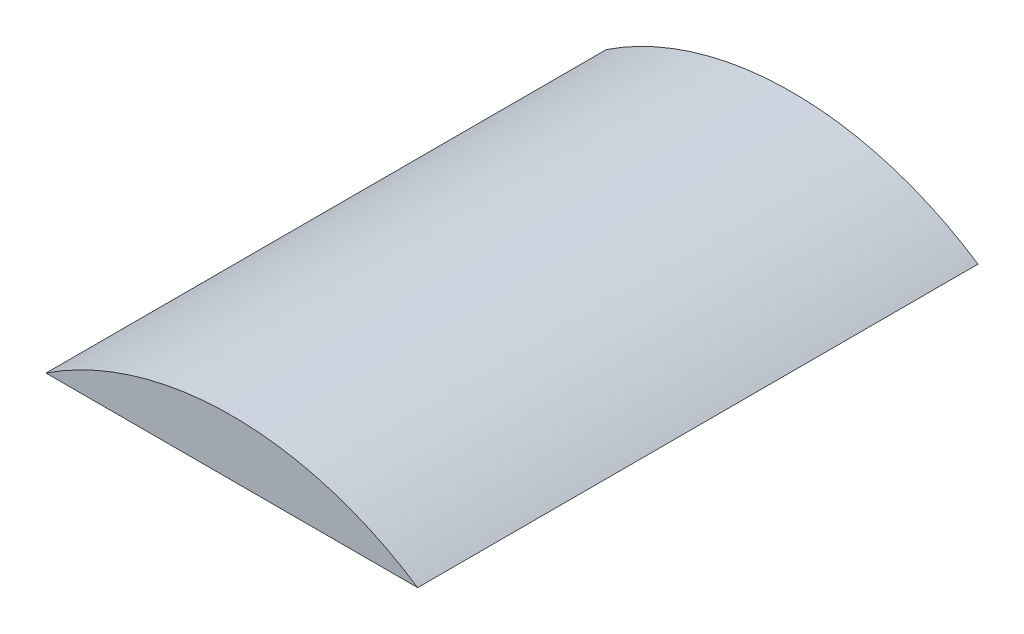
ISO-10303-21;
HEADER;
FILE_DESCRIPTION(('STEP AP214'),'2;1');
FILE_NAME('part.step','',(''),(''),'','','');
FILE_SCHEMA(('AUTOMOTIVE_DESIGN { 1 0 10303 214 1 1 1 1 }'));
ENDSEC;
DATA;
#1=APPLICATION_CONTEXT('core data for automotive mechanical design processes');
#2=APPLICATION_PROTOCOL_DEFINITION('international standard','automotive_design',2000,#1);
#3=PRODUCT_CONTEXT('',#1,'mechanical');
#4=PRODUCT('Part','Part','',(#3));
#5=PRODUCT_RELATED_PRODUCT_CATEGORY('part','',(#4));
#6=PRODUCT_DEFINITION_FORMATION('','',#4);
#7=PRODUCT_DEFINITION_CONTEXT('part definition',#1,'design');
#8=PRODUCT_DEFINITION('design','',#6,#7);
#9=PRODUCT_DEFINITION_SHAPE('','',#8);
#10=(LENGTH_UNIT() NAMED_UNIT(*) SI_UNIT(.MILLI.,.METRE.));
#11=(NAMED_UNIT(*) PLANE_ANGLE_UNIT() SI_UNIT($,.RADIAN.));
#12=(NAMED_UNIT(*) SI_UNIT($,.STERADIAN.) SOLID_ANGLE_UNIT());
#13=UNCERTAINTY_MEASURE_WITH_UNIT(LENGTH_MEASURE(1.E-05),#10,'distance_accuracy_value','');
#14=(GEOMETRIC_REPRESENTATION_CONTEXT(3) GLOBAL_UNCERTAINTY_ASSIGNED_CONTEXT((#13)) GLOBAL_UNIT_ASSIGNED_CONTEXT((#10,
#11,#12)) REPRESENTATION_CONTEXT('',''));
#15=CARTESIAN_POINT('',(0.,0.,0.));
#16=DIRECTION('',(0.,0.,1.));
#17=DIRECTION('',(1.,0.,0.));
#18=AXIS2_PLACEMENT_3D('',#15,#16,#17);
#19=CARTESIAN_POINT('',(0.,0.,5.));
#20=DIRECTION('',(0.,0.,-1.));
#21=DIRECTION('',(-1.,0.,0.));
#22=AXIS2_PLACEMENT_3D('',#19,#20,#21);
#23=CYLINDRICAL_SURFACE('',#22,3.);
#24=CARTESIAN_POINT('',(0.,0.,0.));
#25=DIRECTION('',(0.,0.,1.));
#26=DIRECTION('',(1.,0.,0.));
#27=AXIS2_PLACEMENT_3D('',#24,#25,#26);
#28=CIRCLE('',#27,3.);
#29=CARTESIAN_POINT('',(1.6583123951777,2.5,0.));
#30=VERTEX_POINT('',#29);
#31=CARTESIAN_POINT('',(-1.6583123951777,2.5,0.));
#32=VERTEX_POINT('',#31);
#33=EDGE_CURVE('E64',#30,#32,#28,.T.);
#34=ORIENTED_EDGE('',*,*,#33,.T.);
#35=DIRECTION('',(0.,0.,-1.));
#36=VECTOR('',#35,1.);
#37=CARTESIAN_POINT('',(-1.6583123951777,2.5,5.));
#38=LINE('',#37,#36);
#39=CARTESIAN_POINT('',(-1.6583123951777,2.5,5.));
#40=VERTEX_POINT('',#39);
#41=EDGE_CURVE('E11',#40,#32,#38,.T.);
#42=ORIENTED_EDGE('',*,*,#41,.F.);
#43=CARTESIAN_POINT('',(0.,0.,5.));
#44=DIRECTION('',(0.,0.,1.));
#45=DIRECTION('',(1.,0.,0.));
#46=AXIS2_PLACEMENT_3D('',#43,#44,#45);
#47=CIRCLE('',#46,3.);
#48=CARTESIAN_POINT('',(1.6583123951777,2.5,5.));
#49=VERTEX_POINT('',#48);
#50=EDGE_CURVE('E63',#49,#40,#47,.T.);
#51=ORIENTED_EDGE('',*,*,#50,.F.);
#52=DIRECTION('',(0.,0.,-1.));
#53=VECTOR('',#52,1.);
#54=CARTESIAN_POINT('',(1.6583123951777,2.5,5.));
#55=LINE('',#54,#53);
#56=EDGE_CURVE('E41',#49,#30,#55,.T.);
#57=ORIENTED_EDGE('',*,*,#56,.T.);
#58=EDGE_LOOP('',(#34,#42,#51,#57));
#59=FACE_BOUND('',#58,.T.);
#60=ADVANCED_FACE('F33',(#59),#23,.T.);
#61=CARTESIAN_POINT('',(-1.6583123951777,2.5,5.));
#62=DIRECTION('',(0.,1.,0.));
#63=DIRECTION('',(0.,0.,1.));
#64=AXIS2_PLACEMENT_3D('',#61,#62,#63);
#65=PLANE('',#64);
#66=DIRECTION('',(1.,0.,0.));
#67=VECTOR('',#66,1.);
#68=CARTESIAN_POINT('',(-1.6583123951777,2.5,0.));
#69=LINE('',#68,#67);
#70=EDGE_CURVE('E56',#32,#30,#69,.T.);
#71=ORIENTED_EDGE('',*,*,#70,.T.);
#72=ORIENTED_EDGE('',*,*,#56,.F.);
#73=DIRECTION('',(1.,0.,0.));
#74=VECTOR('',#73,1.);
#75=CARTESIAN_POINT('',(-1.6583123951777,2.5,5.));
#76=LINE('',#75,#74);
#77=EDGE_CURVE('E48',#40,#49,#76,.T.);
#78=ORIENTED_EDGE('',*,*,#77,.F.);
#79=ORIENTED_EDGE('',*,*,#41,.T.);
#80=EDGE_LOOP('',(#71,#72,#78,#79));
#81=FACE_BOUND('',#80,.T.);
#82=ADVANCED_FACE('F59',(#81),#65,.F.);
#83=CARTESIAN_POINT('',(0.,0.,5.));
#84=DIRECTION('',(0.,0.,1.));
#85=DIRECTION('',(1.,0.,0.));
#86=AXIS2_PLACEMENT_3D('',#83,#84,#85);
#87=PLANE('',#86);
#88=ORIENTED_EDGE('',*,*,#50,.T.);
#89=ORIENTED_EDGE('',*,*,#77,.T.);
#90=EDGE_LOOP('',(#88,#89));
#91=FACE_BOUND('',#90,.T.);
#92=ADVANCED_FACE('F71',(#91),#87,.T.);
#93=CARTESIAN_POINT('',(0.,0.,0.));
#94=DIRECTION('',(0.,0.,1.));
#95=DIRECTION('',(1.,0.,0.));
#96=AXIS2_PLACEMENT_3D('',#93,#94,#95);
#97=PLANE('',#96);
#98=ORIENTED_EDGE('',*,*,#33,.F.);
#99=ORIENTED_EDGE('',*,*,#70,.F.);
#100=EDGE_LOOP('',(#98,#99));
#101=FACE_BOUND('',#100,.T.);
#102=ADVANCED_FACE('F67',(#101),#97,.F.);
#103=CLOSED_SHELL('',(#60,#82,#92,#102));
#104=MANIFOLD_SOLID_BREP('B2',#103);
#105=ADVANCED_BREP_SHAPE_REPRESENTATION('',(#18,#104),#14);
#106=SHAPE_DEFINITION_REPRESENTATION(#9,#105);
ENDSEC;
END-ISO-10303-21;
